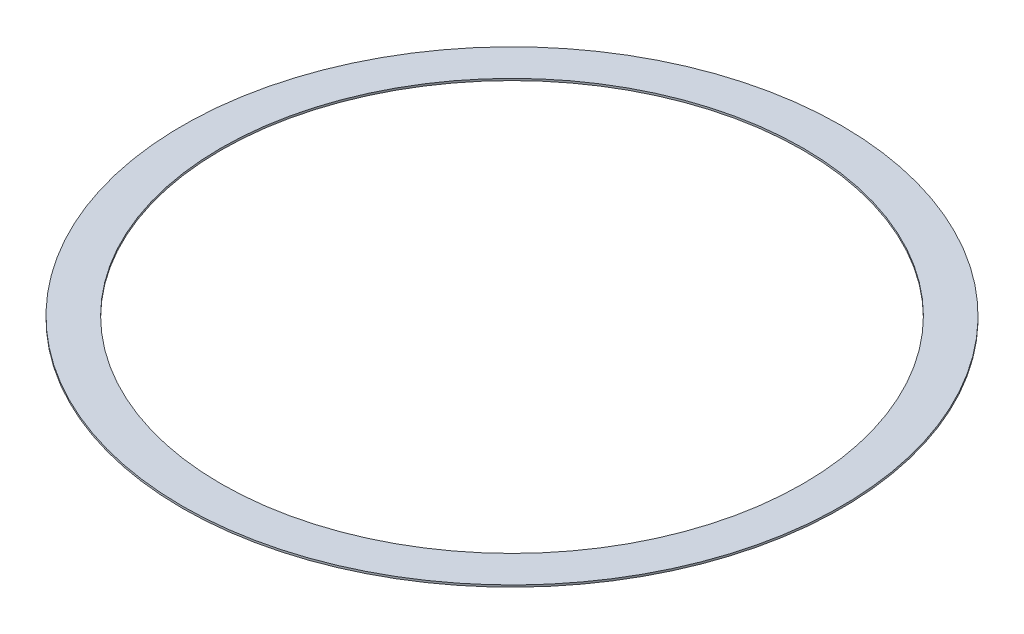
ISO-10303-21;
HEADER;
FILE_DESCRIPTION(('STEP AP214'),'2;1');
FILE_NAME('part.step','',(''),(''),'','','');
FILE_SCHEMA(('AUTOMOTIVE_DESIGN { 1 0 10303 214 1 1 1 1 }'));
ENDSEC;
DATA;
#1=APPLICATION_CONTEXT('core data for automotive mechanical design processes');
#2=APPLICATION_PROTOCOL_DEFINITION('international standard','automotive_design',2000,#1);
#3=PRODUCT_CONTEXT('',#1,'mechanical');
#4=PRODUCT('Part','Part','',(#3));
#5=PRODUCT_RELATED_PRODUCT_CATEGORY('part','',(#4));
#6=PRODUCT_DEFINITION_FORMATION('','',#4);
#7=PRODUCT_DEFINITION_CONTEXT('part definition',#1,'design');
#8=PRODUCT_DEFINITION('design','',#6,#7);
#9=PRODUCT_DEFINITION_SHAPE('','',#8);
#10=(LENGTH_UNIT() NAMED_UNIT(*) SI_UNIT(.MILLI.,.METRE.));
#11=(NAMED_UNIT(*) PLANE_ANGLE_UNIT() SI_UNIT($,.RADIAN.));
#12=(NAMED_UNIT(*) SI_UNIT($,.STERADIAN.) SOLID_ANGLE_UNIT());
#13=UNCERTAINTY_MEASURE_WITH_UNIT(LENGTH_MEASURE(1.E-05),#10,'distance_accuracy_value','');
#14=(GEOMETRIC_REPRESENTATION_CONTEXT(3) GLOBAL_UNCERTAINTY_ASSIGNED_CONTEXT((#13)) GLOBAL_UNIT_ASSIGNED_CONTEXT((#10,
#11,#12)) REPRESENTATION_CONTEXT('',''));
#15=CARTESIAN_POINT('',(0.,0.,0.));
#16=DIRECTION('',(0.,0.,1.));
#17=DIRECTION('',(1.,0.,0.));
#18=AXIS2_PLACEMENT_3D('',#15,#16,#17);
#19=CARTESIAN_POINT('',(0.,1.24999999999997,0.));
#20=DIRECTION('',(0.,1.,0.));
#21=DIRECTION('',(0.,0.,1.));
#22=AXIS2_PLACEMENT_3D('',#19,#20,#21);
#23=PLANE('',#22);
#24=CARTESIAN_POINT('',(0.,1.24999999999997,0.));
#25=DIRECTION('',(0.,1.,0.));
#26=DIRECTION('',(0.,0.,1.));
#27=AXIS2_PLACEMENT_3D('',#24,#25,#26);
#28=CIRCLE('',#27,426.5);
#29=CARTESIAN_POINT('',(0.,1.24999999999997,426.5));
#30=VERTEX_POINT('',#29);
#31=EDGE_CURVE('E10',#30,#30,#28,.T.);
#32=ORIENTED_EDGE('',*,*,#31,.T.);
#33=EDGE_LOOP('',(#32));
#34=FACE_BOUND('',#33,.T.);
#35=CARTESIAN_POINT('',(0.,1.24999999999997,0.));
#36=DIRECTION('',(0.,1.,0.));
#37=DIRECTION('',(0.,0.,1.));
#38=AXIS2_PLACEMENT_3D('',#35,#36,#37);
#39=CIRCLE('',#38,376.5);
#40=CARTESIAN_POINT('',(0.,1.24999999999997,376.5));
#41=VERTEX_POINT('',#40);
#42=EDGE_CURVE('E47',#41,#41,#39,.T.);
#43=ORIENTED_EDGE('',*,*,#42,.F.);
#44=EDGE_LOOP('',(#43));
#45=FACE_BOUND('',#44,.T.);
#46=ADVANCED_FACE('F33',(#34,#45),#23,.T.);
#47=CARTESIAN_POINT('',(0.,-1.24999999999997,0.));
#48=DIRECTION('',(0.,1.,0.));
#49=DIRECTION('',(0.,0.,1.));
#50=AXIS2_PLACEMENT_3D('',#47,#48,#49);
#51=PLANE('',#50);
#52=CARTESIAN_POINT('',(0.,-1.24999999999997,0.));
#53=DIRECTION('',(0.,1.,0.));
#54=DIRECTION('',(0.,0.,1.));
#55=AXIS2_PLACEMENT_3D('',#52,#53,#54);
#56=CIRCLE('',#55,426.5);
#57=CARTESIAN_POINT('',(0.,-1.24999999999997,426.5));
#58=VERTEX_POINT('',#57);
#59=EDGE_CURVE('E37',#58,#58,#56,.T.);
#60=ORIENTED_EDGE('',*,*,#59,.F.);
#61=EDGE_LOOP('',(#60));
#62=FACE_BOUND('',#61,.T.);
#63=CARTESIAN_POINT('',(0.,-1.24999999999997,0.));
#64=DIRECTION('',(0.,1.,0.));
#65=DIRECTION('',(0.,0.,1.));
#66=AXIS2_PLACEMENT_3D('',#63,#64,#65);
#67=CIRCLE('',#66,376.5);
#68=CARTESIAN_POINT('',(0.,-1.24999999999997,376.5));
#69=VERTEX_POINT('',#68);
#70=EDGE_CURVE('E49',#69,#69,#67,.T.);
#71=ORIENTED_EDGE('',*,*,#70,.T.);
#72=EDGE_LOOP('',(#71));
#73=FACE_BOUND('',#72,.T.);
#74=ADVANCED_FACE('F62',(#62,#73),#51,.F.);
#75=CARTESIAN_POINT('',(0.,1.24999999999997,0.));
#76=DIRECTION('',(0.,-1.,0.));
#77=DIRECTION('',(0.,0.,-1.));
#78=AXIS2_PLACEMENT_3D('',#75,#76,#77);
#79=CYLINDRICAL_SURFACE('',#78,426.5);
#80=ORIENTED_EDGE('',*,*,#31,.F.);
#81=EDGE_LOOP('',(#80));
#82=FACE_BOUND('',#81,.T.);
#83=ORIENTED_EDGE('',*,*,#59,.T.);
#84=EDGE_LOOP('',(#83));
#85=FACE_BOUND('',#84,.T.);
#86=ADVANCED_FACE('F35',(#82,#85),#79,.T.);
#87=CARTESIAN_POINT('',(0.,1.24999999999997,0.));
#88=DIRECTION('',(0.,-1.,0.));
#89=DIRECTION('',(0.,0.,-1.));
#90=AXIS2_PLACEMENT_3D('',#87,#88,#89);
#91=CYLINDRICAL_SURFACE('',#90,376.5);
#92=ORIENTED_EDGE('',*,*,#42,.T.);
#93=EDGE_LOOP('',(#92));
#94=FACE_BOUND('',#93,.T.);
#95=ORIENTED_EDGE('',*,*,#70,.F.);
#96=EDGE_LOOP('',(#95));
#97=FACE_BOUND('',#96,.T.);
#98=ADVANCED_FACE('F58',(#94,#97),#91,.F.);
#99=CLOSED_SHELL('',(#46,#74,#86,#98));
#100=MANIFOLD_SOLID_BREP('B2',#99);
#101=ADVANCED_BREP_SHAPE_REPRESENTATION('',(#18,#100),#14);
#102=SHAPE_DEFINITION_REPRESENTATION(#9,#101);
ENDSEC;
END-ISO-10303-21;
